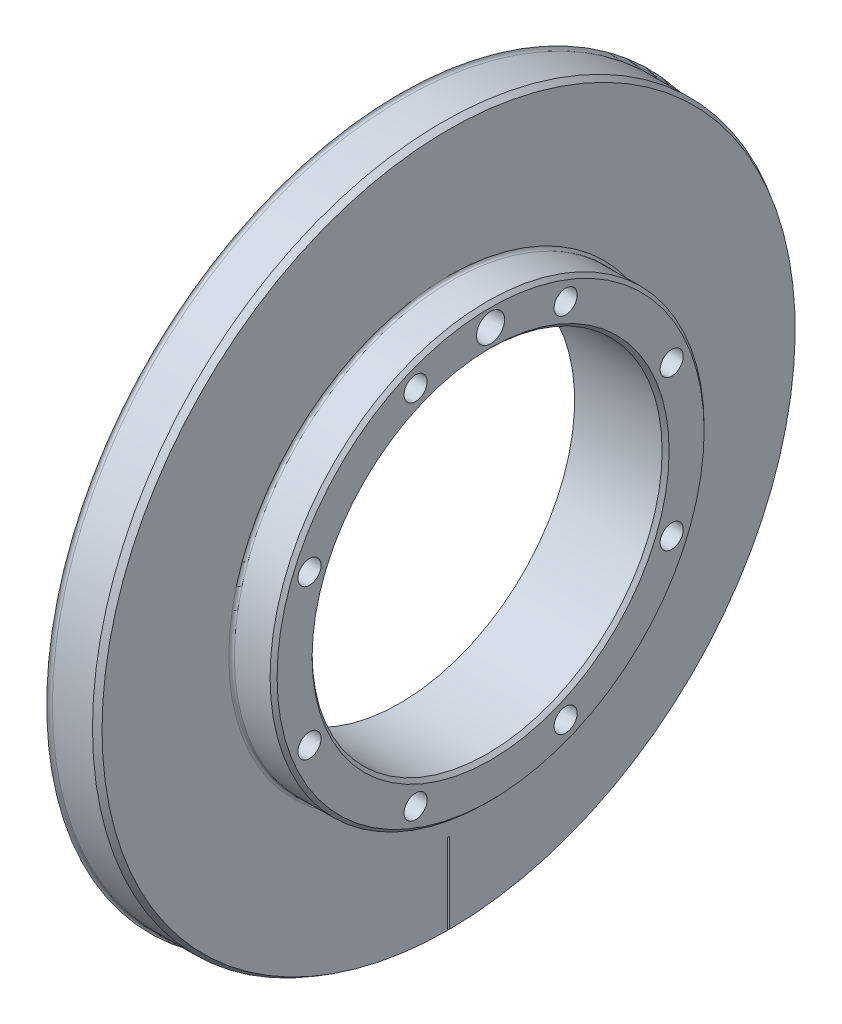
ISO-10303-21;
HEADER;
FILE_DESCRIPTION(('STEP AP214'),'2;1');
FILE_NAME('part.step','',(''),(''),'','','');
FILE_SCHEMA(('AUTOMOTIVE_DESIGN { 1 0 10303 214 1 1 1 1 }'));
ENDSEC;
DATA;
#1=APPLICATION_CONTEXT('core data for automotive mechanical design processes');
#2=APPLICATION_PROTOCOL_DEFINITION('international standard','automotive_design',2000,#1);
#3=PRODUCT_CONTEXT('',#1,'mechanical');
#4=PRODUCT('Part','Part','',(#3));
#5=PRODUCT_RELATED_PRODUCT_CATEGORY('part','',(#4));
#6=PRODUCT_DEFINITION_FORMATION('','',#4);
#7=PRODUCT_DEFINITION_CONTEXT('part definition',#1,'design');
#8=PRODUCT_DEFINITION('design','',#6,#7);
#9=PRODUCT_DEFINITION_SHAPE('','',#8);
#10=(LENGTH_UNIT() NAMED_UNIT(*) SI_UNIT(.MILLI.,.METRE.));
#11=(NAMED_UNIT(*) PLANE_ANGLE_UNIT() SI_UNIT($,.RADIAN.));
#12=(NAMED_UNIT(*) SI_UNIT($,.STERADIAN.) SOLID_ANGLE_UNIT());
#13=UNCERTAINTY_MEASURE_WITH_UNIT(LENGTH_MEASURE(1.E-05),#10,'distance_accuracy_value','');
#14=(GEOMETRIC_REPRESENTATION_CONTEXT(3) GLOBAL_UNCERTAINTY_ASSIGNED_CONTEXT((#13)) GLOBAL_UNIT_ASSIGNED_CONTEXT((#10,
#11,#12)) REPRESENTATION_CONTEXT('',''));
#15=CARTESIAN_POINT('',(0.,0.,0.));
#16=DIRECTION('',(0.,0.,1.));
#17=DIRECTION('',(1.,0.,0.));
#18=AXIS2_PLACEMENT_3D('',#15,#16,#17);
#19=CARTESIAN_POINT('',(1038.00000000098,1493.00000000001,0.));
#20=DIRECTION('',(1.,0.,0.));
#21=DIRECTION('',(0.,0.,-1.));
#22=AXIS2_PLACEMENT_3D('',#19,#20,#21);
#23=CONICAL_SURFACE('',#22,1.79999999936855,1.02974425749441);
#24=CARTESIAN_POINT('',(1037.99999999991,1493.00000000001,0.));
#25=DIRECTION('',(1.,0.,0.));
#26=DIRECTION('',(0.,0.,-1.));
#27=AXIS2_PLACEMENT_3D('',#24,#25,#26);
#28=CIRCLE('',#27,1.79999999999991);
#29=CARTESIAN_POINT('',(1037.99999999991,1493.00000000001,-1.79999999999991));
#30=VERTEX_POINT('',#29);
#31=EDGE_CURVE('E121',#30,#30,#28,.T.);
#32=ORIENTED_EDGE('',*,*,#31,.T.);
#33=EDGE_LOOP('',(#32));
#34=FACE_BOUND('',#33,.T.);
#35=CARTESIAN_POINT('',(1036.91845088429,1493.00000000001,0.));
#36=VERTEX_POINT('',#35);
#37=VERTEX_LOOP('',#36);
#38=FACE_BOUND('',#37,.T.);
#39=ADVANCED_FACE('F17',(#34,#38),#23,.F.);
#40=CARTESIAN_POINT('',(1036.51437343015,1493.00000000001,0.));
#41=DIRECTION('',(1.,0.,0.));
#42=DIRECTION('',(0.,0.,-1.));
#43=AXIS2_PLACEMENT_3D('',#40,#41,#42);
#44=CYLINDRICAL_SURFACE('',#43,1.79999999999991);
#45=ORIENTED_EDGE('',*,*,#31,.F.);
#46=EDGE_LOOP('',(#45));
#47=FACE_BOUND('',#46,.T.);
#48=CARTESIAN_POINT('',(1038.99999999991,1493.00000000001,0.));
#49=DIRECTION('',(1.,0.,0.));
#50=DIRECTION('',(0.,0.,-1.));
#51=AXIS2_PLACEMENT_3D('',#48,#49,#50);
#52=CIRCLE('',#51,1.79999999999991);
#53=CARTESIAN_POINT('',(1038.99999999991,1493.00000000001,-1.79999999999991));
#54=VERTEX_POINT('',#53);
#55=EDGE_CURVE('E164',#54,#54,#52,.T.);
#56=ORIENTED_EDGE('',*,*,#55,.T.);
#57=EDGE_LOOP('',(#56));
#58=FACE_BOUND('',#57,.T.);
#59=ADVANCED_FACE('F299',(#47,#58),#44,.F.);
#60=CARTESIAN_POINT('',(945.00000000003,1426.99999999988,0.));
#61=DIRECTION('',(0.,1.,0.));
#62=DIRECTION('',(0.,0.,1.));
#63=AXIS2_PLACEMENT_3D('',#60,#61,#62);
#64=PLANE('',#63);
#65=DIRECTION('',(-0.866025403784429,0.,0.500000000000017));
#66=VECTOR('',#65,1.);
#67=CARTESIAN_POINT('',(1038.99999999991,1426.99999999988,-0.14433756729744));
#68=LINE('',#67,#66);
#69=CARTESIAN_POINT('',(1038.75000000012,1426.99999999988,-9.87854998178485E-11));
#70=VERTEX_POINT('',#69);
#71=CARTESIAN_POINT('',(1038.99999999991,1426.99999999988,-0.14433756729744));
#72=VERTEX_POINT('',#71);
#73=EDGE_CURVE('E112',#70,#72,#68,.F.);
#74=ORIENTED_EDGE('',*,*,#73,.T.);
#75=DIRECTION('',(0.,0.,1.));
#76=VECTOR('',#75,1.);
#77=CARTESIAN_POINT('',(1038.99999999991,1426.99999999988,0.));
#78=LINE('',#77,#76);
#79=CARTESIAN_POINT('',(1038.99999999992,1426.99999999988,0.144337567278896));
#80=VERTEX_POINT('',#79);
#81=EDGE_CURVE('E166',#72,#80,#78,.T.);
#82=ORIENTED_EDGE('',*,*,#81,.T.);
#83=DIRECTION('',(0.866025403784429,0.,0.500000000000017));
#84=VECTOR('',#83,1.);
#85=CARTESIAN_POINT('',(1038.75000000004,1426.99999999988,0.));
#86=LINE('',#85,#84);
#87=EDGE_CURVE('E109',#80,#70,#86,.F.);
#88=ORIENTED_EDGE('',*,*,#87,.T.);
#89=EDGE_LOOP('',(#74,#82,#88));
#90=FACE_BOUND('',#89,.T.);
#91=ADVANCED_FACE('F297',(#90),#64,.F.);
#92=CARTESIAN_POINT('',(1038.75000000004,1426.99999999988,0.));
#93=DIRECTION('',(-0.500000000000017,0.,0.866025403784429));
#94=DIRECTION('',(0.866025403784429,0.,0.500000000000017));
#95=AXIS2_PLACEMENT_3D('',#92,#93,#94);
#96=PLANE('',#95);
#97=DIRECTION('',(0.,1.,0.));
#98=VECTOR('',#97,1.);
#99=CARTESIAN_POINT('',(1038.75000000016,1426.99999999988,-1.48180404578591E-10));
#100=LINE('',#99,#98);
#101=CARTESIAN_POINT('',(1038.74999975354,1415.35566229019,1.64934846772689E-08));
#102=VERTEX_POINT('',#101);
#103=EDGE_CURVE('E100',#102,#70,#100,.T.);
#104=ORIENTED_EDGE('',*,*,#103,.T.);
#105=ORIENTED_EDGE('',*,*,#87,.F.);
#106=DIRECTION('',(0.,1.,0.));
#107=VECTOR('',#106,1.);
#108=CARTESIAN_POINT('',(1038.99999999991,1464.99999999998,0.144337567297364));
#109=LINE('',#108,#107);
#110=CARTESIAN_POINT('',(1039.00000000012,1415.50021043778,0.144337567318507));
#111=VERTEX_POINT('',#110);
#112=EDGE_CURVE('E108',#80,#111,#109,.F.);
#113=ORIENTED_EDGE('',*,*,#112,.T.);
#114=CARTESIAN_POINT('',(1038.74999994207,1415.35566239901,-3.34663569285116E-08));
#115=CARTESIAN_POINT('',(1038.79167879641,1415.37972565586,0.0240632643035083));
#116=CARTESIAN_POINT('',(1038.83335156174,1415.40380295418,0.0481230465874393));
#117=CARTESIAN_POINT('',(1038.91668491442,1415.45198563376,0.0962355801894317));
#118=CARTESIAN_POINT('',(1038.95834550176,1415.47609101503,0.120288331507491));
#119=CARTESIAN_POINT('',(1039.00000000011,1415.50021043777,0.144337567339615));
#120=B_SPLINE_CURVE_WITH_KNOTS('',3,(#114,#115,#116,#117,#118,#119),.UNSPECIFIED.,.F.,.F.,(4,2,
4),(0.,0.161421433201902,0.322842866444055),.UNSPECIFIED.);
#121=EDGE_CURVE('E92',#102,#111,#120,.T.);
#122=ORIENTED_EDGE('',*,*,#121,.F.);
#123=EDGE_LOOP('',(#104,#105,#113,#122));
#124=FACE_BOUND('',#123,.T.);
#125=ADVANCED_FACE('F104',(#124),#96,.F.);
#126=CARTESIAN_POINT('',(1038.99999999991,1426.99999999988,-0.14433756729744));
#127=DIRECTION('',(-0.500000000000017,0.,-0.866025403784429));
#128=DIRECTION('',(-0.866025403784429,0.,0.500000000000017));
#129=AXIS2_PLACEMENT_3D('',#126,#127,#128);
#130=PLANE('',#129);
#131=ORIENTED_EDGE('',*,*,#103,.F.);
#132=CARTESIAN_POINT('',(1038.99999999998,1415.50021043785,-0.144337567463763));
#133=CARTESIAN_POINT('',(1038.9583455017,1415.47609101508,-0.120288331604589));
#134=CARTESIAN_POINT('',(1038.9166849144,1415.4519856338,-0.0962355802717079));
#135=CARTESIAN_POINT('',(1038.83335156178,1415.40380295421,-0.0481230466644701));
#136=CARTESIAN_POINT('',(1038.79167879646,1415.3797256559,-0.0240632643901151));
#137=CARTESIAN_POINT('',(1038.74999994213,1415.35566239907,3.33579455901028E-08));
#138=B_SPLINE_CURVE_WITH_KNOTS('',3,(#132,#133,#134,#135,#136,#137),.UNSPECIFIED.,.F.,.F.,(4,2,
4),(0.,0.161421433177669,0.322842866315485),.UNSPECIFIED.);
#139=CARTESIAN_POINT('',(1039.00000000008,1415.50021043778,-0.144337567343978));
#140=VERTEX_POINT('',#139);
#141=EDGE_CURVE('E89',#140,#102,#138,.T.);
#142=ORIENTED_EDGE('',*,*,#141,.F.);
#143=DIRECTION('',(0.,1.,0.));
#144=VECTOR('',#143,1.);
#145=CARTESIAN_POINT('',(1038.99999999991,1464.99999999998,-0.14433756729744));
#146=LINE('',#145,#144);
#147=EDGE_CURVE('E261',#140,#72,#146,.T.);
#148=ORIENTED_EDGE('',*,*,#147,.T.);
#149=ORIENTED_EDGE('',*,*,#73,.F.);
#150=EDGE_LOOP('',(#131,#142,#148,#149));
#151=FACE_BOUND('',#150,.T.);
#152=ADVANCED_FACE('F111',(#151),#130,.F.);
#153=CARTESIAN_POINT('',(1039.40000000001,1464.99999999998,0.));
#154=DIRECTION('',(-1.,0.,0.));
#155=DIRECTION('',(0.,-0.999975174771761,0.0070462642716927));
#156=AXIS2_PLACEMENT_3D('',#153,#154,#155);
#157=TOROIDAL_SURFACE('',#156,31.4000000000013,0.399999999999924);
#158=CARTESIAN_POINT('',(1039.40000000001,1464.99999999998,0.));
#159=DIRECTION('',(-1.,0.,0.));
#160=DIRECTION('',(0.,0.,1.));
#161=AXIS2_PLACEMENT_3D('',#158,#159,#160);
#162=CIRCLE('',#161,31.000000000003);
#163=CARTESIAN_POINT('',(1039.40000000001,1464.99999999998,31.000000000003));
#164=VERTEX_POINT('',#163);
#165=EDGE_CURVE('E114',#164,#164,#162,.F.);
#166=ORIENTED_EDGE('',*,*,#165,.F.);
#167=EDGE_LOOP('',(#166));
#168=FACE_BOUND('',#167,.T.);
#169=CARTESIAN_POINT('',(1039.00000000001,1464.99999999998,0.));
#170=DIRECTION('',(1.,0.,0.));
#171=DIRECTION('',(0.,1.,0.));
#172=AXIS2_PLACEMENT_3D('',#169,#170,#171);
#173=CIRCLE('',#172,31.3999999999761);
#174=CARTESIAN_POINT('',(1038.99999999997,1496.39999999997,0.));
#175=VERTEX_POINT('',#174);
#176=CARTESIAN_POINT('',(1038.99999999997,1433.6,0.));
#177=VERTEX_POINT('',#176);
#178=EDGE_CURVE('E254',#175,#177,#173,.T.);
#179=ORIENTED_EDGE('',*,*,#178,.T.);
#180=CARTESIAN_POINT('',(1039.00000000001,1464.99999999998,0.));
#181=DIRECTION('',(1.,0.,0.));
#182=DIRECTION('',(0.,-1.,0.));
#183=AXIS2_PLACEMENT_3D('',#180,#181,#182);
#184=CIRCLE('',#183,31.3999999999883);
#185=EDGE_CURVE('E252',#177,#175,#184,.T.);
#186=ORIENTED_EDGE('',*,*,#185,.T.);
#187=EDGE_LOOP('',(#179,#186));
#188=FACE_BOUND('',#187,.T.);
#189=ADVANCED_FACE('F274',(#168,#188),#157,.F.);
#190=CARTESIAN_POINT('',(1032.9999999999,1490.8686269103,-10.7151361062228));
#191=DIRECTION('',(1.,0.,0.));
#192=DIRECTION('',(0.,0.,-1.));
#193=AXIS2_PLACEMENT_3D('',#190,#191,#192);
#194=CONICAL_SURFACE('',#193,1.6499999999888,1.02974425748401);
#195=CARTESIAN_POINT('',(1032.00857997587,1490.8686269103,-10.715136106171));
#196=VERTEX_POINT('',#195);
#197=VERTEX_LOOP('',#196);
#198=FACE_BOUND('',#197,.T.);
#199=CARTESIAN_POINT('',(1032.99999999988,1490.8686269103,-10.7151361062228));
#200=DIRECTION('',(-1.,0.,0.));
#201=DIRECTION('',(0.,0.,1.));
#202=AXIS2_PLACEMENT_3D('',#199,#200,#201);
#203=CIRCLE('',#202,1.65);
#204=CARTESIAN_POINT('',(1032.99999999988,1490.8686269103,-9.0651361062228));
#205=VERTEX_POINT('',#204);
#206=EDGE_CURVE('E257',#205,#205,#203,.F.);
#207=ORIENTED_EDGE('',*,*,#206,.T.);
#208=EDGE_LOOP('',(#207));
#209=FACE_BOUND('',#208,.T.);
#210=ADVANCED_FACE('F278',(#198,#209),#194,.F.);
#211=CARTESIAN_POINT('',(1032.9999999999,1475.7151361062,-25.8686269103161));
#212=DIRECTION('',(1.,0.,0.));
#213=DIRECTION('',(0.,0.,-1.));
#214=AXIS2_PLACEMENT_3D('',#211,#212,#213);
#215=CONICAL_SURFACE('',#214,1.65000000004816,1.02974425751171);
#216=CARTESIAN_POINT('',(1032.00857997587,1475.7151361062,-25.8686269103237));
#217=VERTEX_POINT('',#216);
#218=VERTEX_LOOP('',#217);
#219=FACE_BOUND('',#218,.T.);
#220=CARTESIAN_POINT('',(1032.99999999988,1475.7151361062,-25.8686269103161));
#221=DIRECTION('',(-1.,0.,0.));
#222=DIRECTION('',(0.,0.,1.));
#223=AXIS2_PLACEMENT_3D('',#220,#221,#222);
#224=CIRCLE('',#223,1.65);
#225=CARTESIAN_POINT('',(1032.99999999988,1475.7151361062,-24.2186269103161));
#226=VERTEX_POINT('',#225);
#227=EDGE_CURVE('E259',#226,#226,#224,.F.);
#228=ORIENTED_EDGE('',*,*,#227,.T.);
#229=EDGE_LOOP('',(#228));
#230=FACE_BOUND('',#229,.T.);
#231=ADVANCED_FACE('F400',(#219,#230),#215,.F.);
#232=CARTESIAN_POINT('',(1032.9999999999,1454.28486389376,-25.8686269103161));
#233=DIRECTION('',(1.,0.,0.));
#234=DIRECTION('',(0.,0.,-1.));
#235=AXIS2_PLACEMENT_3D('',#232,#233,#234);
#236=CONICAL_SURFACE('',#235,1.65000000004816,1.02974425751171);
#237=CARTESIAN_POINT('',(1032.00857997587,1454.28486389376,-25.8686269103237));
#238=VERTEX_POINT('',#237);
#239=VERTEX_LOOP('',#238);
#240=FACE_BOUND('',#239,.T.);
#241=CARTESIAN_POINT('',(1032.99999999988,1454.28486389376,-25.8686269103161));
#242=DIRECTION('',(-1.,0.,0.));
#243=DIRECTION('',(0.,0.,1.));
#244=AXIS2_PLACEMENT_3D('',#241,#242,#243);
#245=CIRCLE('',#244,1.65);
#246=CARTESIAN_POINT('',(1032.99999999988,1454.28486389376,-24.2186269103161));
#247=VERTEX_POINT('',#246);
#248=EDGE_CURVE('E387',#247,#247,#245,.F.);
#249=ORIENTED_EDGE('',*,*,#248,.T.);
#250=EDGE_LOOP('',(#249));
#251=FACE_BOUND('',#250,.T.);
#252=ADVANCED_FACE('F403',(#240,#251),#236,.F.);
#253=CARTESIAN_POINT('',(1032.9999999999,1439.13137308967,-10.7151361062224));
#254=DIRECTION('',(1.,0.,0.));
#255=DIRECTION('',(0.,0.,-1.));
#256=AXIS2_PLACEMENT_3D('',#253,#254,#255);
#257=CONICAL_SURFACE('',#256,1.64999999998918,1.02974425748422);
#258=CARTESIAN_POINT('',(1032.00857997587,1439.13137308967,-10.715136106171));
#259=VERTEX_POINT('',#258);
#260=VERTEX_LOOP('',#259);
#261=FACE_BOUND('',#260,.T.);
#262=CARTESIAN_POINT('',(1032.99999999988,1439.13137308967,-10.7151361062224));
#263=DIRECTION('',(-1.,0.,0.));
#264=DIRECTION('',(0.,0.,1.));
#265=AXIS2_PLACEMENT_3D('',#262,#263,#264);
#266=CIRCLE('',#265,1.65);
#267=CARTESIAN_POINT('',(1032.99999999988,1439.13137308967,-9.06513610622242));
#268=VERTEX_POINT('',#267);
#269=EDGE_CURVE('E382',#268,#268,#266,.F.);
#270=ORIENTED_EDGE('',*,*,#269,.T.);
#271=EDGE_LOOP('',(#270));
#272=FACE_BOUND('',#271,.T.);
#273=ADVANCED_FACE('F409',(#261,#272),#257,.F.);
#274=CARTESIAN_POINT('',(1032.9999999999,1439.13137308967,10.7151361062225));
#275=DIRECTION('',(1.,0.,0.));
#276=DIRECTION('',(0.,0.,-1.));
#277=AXIS2_PLACEMENT_3D('',#274,#275,#276);
#278=CONICAL_SURFACE('',#277,1.64999999992147,1.02974425743788);
#279=CARTESIAN_POINT('',(1032.00857997581,1439.13137308967,10.7151361062847));
#280=VERTEX_POINT('',#279);
#281=VERTEX_LOOP('',#280);
#282=FACE_BOUND('',#281,.T.);
#283=CARTESIAN_POINT('',(1032.99999999988,1439.13137308967,10.7151361062225));
#284=DIRECTION('',(-1.,0.,0.));
#285=DIRECTION('',(0.,0.,1.));
#286=AXIS2_PLACEMENT_3D('',#283,#284,#285);
#287=CIRCLE('',#286,1.65);
#288=CARTESIAN_POINT('',(1032.99999999988,1439.13137308967,12.3651361062225));
#289=VERTEX_POINT('',#288);
#290=EDGE_CURVE('E377',#289,#289,#287,.F.);
#291=ORIENTED_EDGE('',*,*,#290,.T.);
#292=EDGE_LOOP('',(#291));
#293=FACE_BOUND('',#292,.T.);
#294=ADVANCED_FACE('F416',(#282,#293),#278,.F.);
#295=CARTESIAN_POINT('',(1032.9999999999,1454.28486389376,25.8686269103161));
#296=DIRECTION('',(1.,0.,0.));
#297=DIRECTION('',(0.,0.,-1.));
#298=AXIS2_PLACEMENT_3D('',#295,#296,#297);
#299=CONICAL_SURFACE('',#298,1.65000000003297,1.02974425748234);
#300=CARTESIAN_POINT('',(1032.00857997581,1454.28486389376,25.8686269103237));
#301=VERTEX_POINT('',#300);
#302=VERTEX_LOOP('',#301);
#303=FACE_BOUND('',#302,.T.);
#304=CARTESIAN_POINT('',(1032.99999999988,1454.28486389376,25.8686269103161));
#305=DIRECTION('',(-1.,0.,0.));
#306=DIRECTION('',(0.,0.,1.));
#307=AXIS2_PLACEMENT_3D('',#304,#305,#306);
#308=CIRCLE('',#307,1.65);
#309=CARTESIAN_POINT('',(1032.99999999988,1454.28486389376,27.5186269103161));
#310=VERTEX_POINT('',#309);
#311=EDGE_CURVE('E372',#310,#310,#308,.F.);
#312=ORIENTED_EDGE('',*,*,#311,.T.);
#313=EDGE_LOOP('',(#312));
#314=FACE_BOUND('',#313,.T.);
#315=ADVANCED_FACE('F420',(#303,#314),#299,.F.);
#316=CARTESIAN_POINT('',(1032.9999999999,1475.7151361062,25.8686269103161));
#317=DIRECTION('',(1.,0.,0.));
#318=DIRECTION('',(0.,0.,-1.));
#319=AXIS2_PLACEMENT_3D('',#316,#317,#318);
#320=CONICAL_SURFACE('',#319,1.65000000003297,1.02974425748234);
#321=CARTESIAN_POINT('',(1032.00857997581,1475.7151361062,25.8686269103237));
#322=VERTEX_POINT('',#321);
#323=VERTEX_LOOP('',#322);
#324=FACE_BOUND('',#323,.T.);
#325=CARTESIAN_POINT('',(1032.99999999988,1475.7151361062,25.8686269103161));
#326=DIRECTION('',(-1.,0.,0.));
#327=DIRECTION('',(0.,0.,1.));
#328=AXIS2_PLACEMENT_3D('',#325,#326,#327);
#329=CIRCLE('',#328,1.65);
#330=CARTESIAN_POINT('',(1032.99999999988,1475.7151361062,27.5186269103161));
#331=VERTEX_POINT('',#330);
#332=EDGE_CURVE('E367',#331,#331,#329,.F.);
#333=ORIENTED_EDGE('',*,*,#332,.T.);
#334=EDGE_LOOP('',(#333));
#335=FACE_BOUND('',#334,.T.);
#336=ADVANCED_FACE('F424',(#324,#335),#320,.F.);
#337=CARTESIAN_POINT('',(1032.9999999999,1490.8686269103,10.7151361062225));
#338=DIRECTION('',(1.,0.,0.));
#339=DIRECTION('',(0.,0.,-1.));
#340=AXIS2_PLACEMENT_3D('',#337,#338,#339);
#341=CONICAL_SURFACE('',#340,1.64999999992147,1.02974425743788);
#342=CARTESIAN_POINT('',(1032.00857997581,1490.8686269103,10.7151361062847));
#343=VERTEX_POINT('',#342);
#344=VERTEX_LOOP('',#343);
#345=FACE_BOUND('',#344,.T.);
#346=CARTESIAN_POINT('',(1032.99999999988,1490.8686269103,10.7151361062225));
#347=DIRECTION('',(-1.,0.,0.));
#348=DIRECTION('',(0.,0.,1.));
#349=AXIS2_PLACEMENT_3D('',#346,#347,#348);
#350=CIRCLE('',#349,1.65);
#351=CARTESIAN_POINT('',(1032.99999999988,1490.8686269103,12.3651361062225));
#352=VERTEX_POINT('',#351);
#353=EDGE_CURVE('E271',#352,#352,#350,.F.);
#354=ORIENTED_EDGE('',*,*,#353,.T.);
#355=EDGE_LOOP('',(#354));
#356=FACE_BOUND('',#355,.T.);
#357=ADVANCED_FACE('F428',(#345,#356),#341,.F.);
#358=CARTESIAN_POINT('',(1046.27500000004,1464.99999999998,0.));
#359=DIRECTION('',(-1.,0.,0.));
#360=DIRECTION('',(0.,0.,1.));
#361=AXIS2_PLACEMENT_3D('',#358,#359,#360);
#362=CYLINDRICAL_SURFACE('',#361,31.000000000003);
#363=CARTESIAN_POINT('',(1044.49999999978,1464.99999999998,0.));
#364=DIRECTION('',(-1.,0.,0.));
#365=DIRECTION('',(0.,0.,-1.));
#366=AXIS2_PLACEMENT_3D('',#363,#364,#365);
#367=CIRCLE('',#366,30.999999999766);
#368=CARTESIAN_POINT('',(1044.49999999978,1464.99999999998,-30.999999999766));
#369=VERTEX_POINT('',#368);
#370=EDGE_CURVE('E163',#369,#369,#367,.F.);
#371=ORIENTED_EDGE('',*,*,#370,.F.);
#372=EDGE_LOOP('',(#371));
#373=FACE_BOUND('',#372,.T.);
#374=ORIENTED_EDGE('',*,*,#165,.T.);
#375=EDGE_LOOP('',(#374));
#376=FACE_BOUND('',#375,.T.);
#377=ADVANCED_FACE('F431',(#373,#376),#362,.T.);
#378=CARTESIAN_POINT('',(1038.99999999991,1493.00000000001,0.));
#379=DIRECTION('',(-1.,0.,0.));
#380=DIRECTION('',(0.,0.,1.));
#381=AXIS2_PLACEMENT_3D('',#378,#379,#380);
#382=PLANE('',#381);
#383=ORIENTED_EDGE('',*,*,#55,.F.);
#384=EDGE_LOOP('',(#383));
#385=FACE_BOUND('',#384,.T.);
#386=CARTESIAN_POINT('',(1038.99999999991,1493.00000000001,0.));
#387=DIRECTION('',(-1.,0.,0.));
#388=DIRECTION('',(0.,0.,1.));
#389=AXIS2_PLACEMENT_3D('',#386,#387,#388);
#390=CIRCLE('',#389,1.99999999999987);
#391=CARTESIAN_POINT('',(1038.99999999991,1493.00000000001,1.99999999999987));
#392=VERTEX_POINT('',#391);
#393=EDGE_CURVE('E160',#392,#392,#390,.F.);
#394=ORIENTED_EDGE('',*,*,#393,.T.);
#395=EDGE_LOOP('',(#394));
#396=FACE_BOUND('',#395,.T.);
#397=ADVANCED_FACE('F231',(#385,#396),#382,.F.);
#398=CARTESIAN_POINT('',(1038.99999999991,1464.99999999998,0.));
#399=DIRECTION('',(-1.,0.,0.));
#400=DIRECTION('',(0.,0.,1.));
#401=AXIS2_PLACEMENT_3D('',#398,#399,#400);
#402=PLANE('',#401);
#403=ORIENTED_EDGE('',*,*,#178,.F.);
#404=ORIENTED_EDGE('',*,*,#185,.F.);
#405=EDGE_LOOP('',(#403,#404));
#406=FACE_BOUND('',#405,.T.);
#407=CARTESIAN_POINT('',(1039.00000000008,1464.99999999998,-5.27355936696949E-13));
#408=DIRECTION('',(-1.,0.,0.));
#409=DIRECTION('',(0.,0.,1.));
#410=AXIS2_PLACEMENT_3D('',#407,#408,#409);
#411=CIRCLE('',#410,49.500000000356);
#412=EDGE_CURVE('E95',#111,#140,#411,.T.);
#413=ORIENTED_EDGE('',*,*,#412,.F.);
#414=ORIENTED_EDGE('',*,*,#112,.F.);
#415=ORIENTED_EDGE('',*,*,#81,.F.);
#416=ORIENTED_EDGE('',*,*,#147,.F.);
#417=EDGE_LOOP('',(#413,#414,#415,#416));
#418=FACE_BOUND('',#417,.T.);
#419=ADVANCED_FACE('F226',(#406,#418),#402,.F.);
#420=CARTESIAN_POINT('',(1044.99999999988,1490.8686269103,-10.7151361062228));
#421=DIRECTION('',(-1.,0.,0.));
#422=DIRECTION('',(0.,0.,1.));
#423=AXIS2_PLACEMENT_3D('',#420,#421,#422);
#424=CYLINDRICAL_SURFACE('',#423,1.65);
#425=CARTESIAN_POINT('',(1044.99999999988,1490.8686269103,-10.7151361062228));
#426=DIRECTION('',(-1.,0.,0.));
#427=DIRECTION('',(0.,0.,1.));
#428=AXIS2_PLACEMENT_3D('',#425,#426,#427);
#429=CIRCLE('',#428,1.65);
#430=CARTESIAN_POINT('',(1044.99999999988,1490.8686269103,-9.0651361062228));
#431=VERTEX_POINT('',#430);
#432=EDGE_CURVE('E156',#431,#431,#429,.F.);
#433=ORIENTED_EDGE('',*,*,#432,.T.);
#434=EDGE_LOOP('',(#433));
#435=FACE_BOUND('',#434,.T.);
#436=ORIENTED_EDGE('',*,*,#206,.F.);
#437=EDGE_LOOP('',(#436));
#438=FACE_BOUND('',#437,.T.);
#439=ADVANCED_FACE('F222',(#435,#438),#424,.F.);
#440=CARTESIAN_POINT('',(1044.99999999988,1475.7151361062,-25.8686269103161));
#441=DIRECTION('',(-1.,0.,0.));
#442=DIRECTION('',(0.,0.,1.));
#443=AXIS2_PLACEMENT_3D('',#440,#441,#442);
#444=CYLINDRICAL_SURFACE('',#443,1.65);
#445=CARTESIAN_POINT('',(1044.99999999988,1475.7151361062,-25.8686269103161));
#446=DIRECTION('',(-1.,0.,0.));
#447=DIRECTION('',(0.,0.,1.));
#448=AXIS2_PLACEMENT_3D('',#445,#446,#447);
#449=CIRCLE('',#448,1.65);
#450=CARTESIAN_POINT('',(1044.99999999988,1475.7151361062,-24.2186269103161));
#451=VERTEX_POINT('',#450);
#452=EDGE_CURVE('E153',#451,#451,#449,.F.);
#453=ORIENTED_EDGE('',*,*,#452,.T.);
#454=EDGE_LOOP('',(#453));
#455=FACE_BOUND('',#454,.T.);
#456=ORIENTED_EDGE('',*,*,#227,.F.);
#457=EDGE_LOOP('',(#456));
#458=FACE_BOUND('',#457,.T.);
#459=ADVANCED_FACE('F218',(#455,#458),#444,.F.);
#460=CARTESIAN_POINT('',(1044.99999999988,1454.28486389376,-25.8686269103161));
#461=DIRECTION('',(-1.,0.,0.));
#462=DIRECTION('',(0.,0.,1.));
#463=AXIS2_PLACEMENT_3D('',#460,#461,#462);
#464=CYLINDRICAL_SURFACE('',#463,1.65);
#465=CARTESIAN_POINT('',(1044.99999999988,1454.28486389376,-25.8686269103161));
#466=DIRECTION('',(-1.,0.,0.));
#467=DIRECTION('',(0.,0.,1.));
#468=AXIS2_PLACEMENT_3D('',#465,#466,#467);
#469=CIRCLE('',#468,1.65);
#470=CARTESIAN_POINT('',(1044.99999999988,1454.28486389376,-24.2186269103161));
#471=VERTEX_POINT('',#470);
#472=EDGE_CURVE('E150',#471,#471,#469,.F.);
#473=ORIENTED_EDGE('',*,*,#472,.T.);
#474=EDGE_LOOP('',(#473));
#475=FACE_BOUND('',#474,.T.);
#476=ORIENTED_EDGE('',*,*,#248,.F.);
#477=EDGE_LOOP('',(#476));
#478=FACE_BOUND('',#477,.T.);
#479=ADVANCED_FACE('F214',(#475,#478),#464,.F.);
#480=CARTESIAN_POINT('',(1044.99999999988,1439.13137308967,-10.7151361062224));
#481=DIRECTION('',(-1.,0.,0.));
#482=DIRECTION('',(0.,0.,1.));
#483=AXIS2_PLACEMENT_3D('',#480,#481,#482);
#484=CYLINDRICAL_SURFACE('',#483,1.65);
#485=CARTESIAN_POINT('',(1044.99999999988,1439.13137308967,-10.7151361062224));
#486=DIRECTION('',(-1.,0.,0.));
#487=DIRECTION('',(0.,0.,1.));
#488=AXIS2_PLACEMENT_3D('',#485,#486,#487);
#489=CIRCLE('',#488,1.65);
#490=CARTESIAN_POINT('',(1044.99999999988,1439.13137308967,-9.06513610622242));
#491=VERTEX_POINT('',#490);
#492=EDGE_CURVE('E147',#491,#491,#489,.F.);
#493=ORIENTED_EDGE('',*,*,#492,.T.);
#494=EDGE_LOOP('',(#493));
#495=FACE_BOUND('',#494,.T.);
#496=ORIENTED_EDGE('',*,*,#269,.F.);
#497=EDGE_LOOP('',(#496));
#498=FACE_BOUND('',#497,.T.);
#499=ADVANCED_FACE('F210',(#495,#498),#484,.F.);
#500=CARTESIAN_POINT('',(1044.99999999988,1439.13137308967,10.7151361062225));
#501=DIRECTION('',(-1.,0.,0.));
#502=DIRECTION('',(0.,0.,1.));
#503=AXIS2_PLACEMENT_3D('',#500,#501,#502);
#504=CYLINDRICAL_SURFACE('',#503,1.65);
#505=CARTESIAN_POINT('',(1044.99999999988,1439.13137308967,10.7151361062225));
#506=DIRECTION('',(-1.,0.,0.));
#507=DIRECTION('',(0.,0.,1.));
#508=AXIS2_PLACEMENT_3D('',#505,#506,#507);
#509=CIRCLE('',#508,1.65);
#510=CARTESIAN_POINT('',(1044.99999999988,1439.13137308967,12.3651361062225));
#511=VERTEX_POINT('',#510);
#512=EDGE_CURVE('E144',#511,#511,#509,.F.);
#513=ORIENTED_EDGE('',*,*,#512,.T.);
#514=EDGE_LOOP('',(#513));
#515=FACE_BOUND('',#514,.T.);
#516=ORIENTED_EDGE('',*,*,#290,.F.);
#517=EDGE_LOOP('',(#516));
#518=FACE_BOUND('',#517,.T.);
#519=ADVANCED_FACE('F206',(#515,#518),#504,.F.);
#520=CARTESIAN_POINT('',(1044.99999999988,1454.28486389376,25.8686269103161));
#521=DIRECTION('',(-1.,0.,0.));
#522=DIRECTION('',(0.,0.,1.));
#523=AXIS2_PLACEMENT_3D('',#520,#521,#522);
#524=CYLINDRICAL_SURFACE('',#523,1.65);
#525=CARTESIAN_POINT('',(1044.99999999988,1454.28486389376,25.8686269103161));
#526=DIRECTION('',(-1.,0.,0.));
#527=DIRECTION('',(0.,0.,1.));
#528=AXIS2_PLACEMENT_3D('',#525,#526,#527);
#529=CIRCLE('',#528,1.65);
#530=CARTESIAN_POINT('',(1044.99999999988,1454.28486389376,27.5186269103161));
#531=VERTEX_POINT('',#530);
#532=EDGE_CURVE('E141',#531,#531,#529,.F.);
#533=ORIENTED_EDGE('',*,*,#532,.T.);
#534=EDGE_LOOP('',(#533));
#535=FACE_BOUND('',#534,.T.);
#536=ORIENTED_EDGE('',*,*,#311,.F.);
#537=EDGE_LOOP('',(#536));
#538=FACE_BOUND('',#537,.T.);
#539=ADVANCED_FACE('F202',(#535,#538),#524,.F.);
#540=CARTESIAN_POINT('',(1044.99999999988,1475.7151361062,25.8686269103161));
#541=DIRECTION('',(-1.,0.,0.));
#542=DIRECTION('',(0.,0.,1.));
#543=AXIS2_PLACEMENT_3D('',#540,#541,#542);
#544=CYLINDRICAL_SURFACE('',#543,1.65);
#545=CARTESIAN_POINT('',(1044.99999999988,1475.7151361062,25.8686269103161));
#546=DIRECTION('',(-1.,0.,0.));
#547=DIRECTION('',(0.,0.,1.));
#548=AXIS2_PLACEMENT_3D('',#545,#546,#547);
#549=CIRCLE('',#548,1.65);
#550=CARTESIAN_POINT('',(1044.99999999988,1475.7151361062,27.5186269103161));
#551=VERTEX_POINT('',#550);
#552=EDGE_CURVE('E138',#551,#551,#549,.F.);
#553=ORIENTED_EDGE('',*,*,#552,.T.);
#554=EDGE_LOOP('',(#553));
#555=FACE_BOUND('',#554,.T.);
#556=ORIENTED_EDGE('',*,*,#332,.F.);
#557=EDGE_LOOP('',(#556));
#558=FACE_BOUND('',#557,.T.);
#559=ADVANCED_FACE('F198',(#555,#558),#544,.F.);
#560=CARTESIAN_POINT('',(1044.99999999988,1490.8686269103,10.7151361062225));
#561=DIRECTION('',(-1.,0.,0.));
#562=DIRECTION('',(0.,0.,1.));
#563=AXIS2_PLACEMENT_3D('',#560,#561,#562);
#564=CYLINDRICAL_SURFACE('',#563,1.65);
#565=CARTESIAN_POINT('',(1044.99999999988,1490.8686269103,10.7151361062225));
#566=DIRECTION('',(-1.,0.,0.));
#567=DIRECTION('',(0.,0.,1.));
#568=AXIS2_PLACEMENT_3D('',#565,#566,#567);
#569=CIRCLE('',#568,1.65);
#570=CARTESIAN_POINT('',(1044.99999999988,1490.8686269103,12.3651361062225));
#571=VERTEX_POINT('',#570);
#572=EDGE_CURVE('E135',#571,#571,#569,.F.);
#573=ORIENTED_EDGE('',*,*,#572,.T.);
#574=EDGE_LOOP('',(#573));
#575=FACE_BOUND('',#574,.T.);
#576=ORIENTED_EDGE('',*,*,#353,.F.);
#577=EDGE_LOOP('',(#576));
#578=FACE_BOUND('',#577,.T.);
#579=ADVANCED_FACE('F194',(#575,#578),#564,.F.);
#580=CARTESIAN_POINT('',(1044.49999999978,1464.99999999998,0.));
#581=DIRECTION('',(-1.,0.,0.));
#582=DIRECTION('',(0.,0.,1.));
#583=AXIS2_PLACEMENT_3D('',#580,#581,#582);
#584=CONICAL_SURFACE('',#583,30.999999999766,0.785398162500017);
#585=CARTESIAN_POINT('',(1045.0000000001,1464.99999999998,0.));
#586=DIRECTION('',(-1.,0.,0.));
#587=DIRECTION('',(0.,0.,1.));
#588=AXIS2_PLACEMENT_3D('',#585,#586,#587);
#589=CIRCLE('',#588,30.5000000003437);
#590=CARTESIAN_POINT('',(1045.0000000001,1464.99999999998,30.5000000003437));
#591=VERTEX_POINT('',#590);
#592=EDGE_CURVE('E132',#591,#591,#589,.T.);
#593=ORIENTED_EDGE('',*,*,#592,.T.);
#594=EDGE_LOOP('',(#593));
#595=FACE_BOUND('',#594,.T.);
#596=ORIENTED_EDGE('',*,*,#370,.T.);
#597=EDGE_LOOP('',(#596));
#598=FACE_BOUND('',#597,.T.);
#599=ADVANCED_FACE('F190',(#595,#598),#584,.T.);
#600=CARTESIAN_POINT('',(1044.99999999988,1493.00000000001,0.));
#601=DIRECTION('',(-1.,0.,0.));
#602=DIRECTION('',(0.,0.,1.));
#603=AXIS2_PLACEMENT_3D('',#600,#601,#602);
#604=CYLINDRICAL_SURFACE('',#603,1.99999999999987);
#605=ORIENTED_EDGE('',*,*,#393,.F.);
#606=EDGE_LOOP('',(#605));
#607=FACE_BOUND('',#606,.T.);
#608=CARTESIAN_POINT('',(1044.99999999988,1493.00000000001,0.));
#609=DIRECTION('',(-1.,0.,0.));
#610=DIRECTION('',(0.,0.,1.));
#611=AXIS2_PLACEMENT_3D('',#608,#609,#610);
#612=CIRCLE('',#611,1.99999999999987);
#613=CARTESIAN_POINT('',(1044.99999999988,1493.00000000001,1.99999999999987));
#614=VERTEX_POINT('',#613);
#615=EDGE_CURVE('E129',#614,#614,#612,.F.);
#616=ORIENTED_EDGE('',*,*,#615,.T.);
#617=EDGE_LOOP('',(#616));
#618=FACE_BOUND('',#617,.T.);
#619=ADVANCED_FACE('F183',(#607,#618),#604,.F.);
#620=CARTESIAN_POINT('',(1038.13397459615,1464.99999999998,-5.27355936696949E-13));
#621=DIRECTION('',(-1.,0.,0.));
#622=DIRECTION('',(0.,0.,1.));
#623=AXIS2_PLACEMENT_3D('',#620,#621,#622);
#624=CONICAL_SURFACE('',#623,49.9999999997497,0.523598774999978);
#625=CARTESIAN_POINT('',(1038.13397459633,1464.99999999998,0.));
#626=DIRECTION('',(-1.,0.,0.));
#627=DIRECTION('',(0.,0.,1.));
#628=AXIS2_PLACEMENT_3D('',#625,#626,#627);
#629=CIRCLE('',#628,50.0000000000032);
#630=CARTESIAN_POINT('',(1038.13397459633,1464.99999999998,50.0000000000032));
#631=VERTEX_POINT('',#630);
#632=EDGE_CURVE('E128',#631,#631,#629,.T.);
#633=ORIENTED_EDGE('',*,*,#632,.F.);
#634=EDGE_LOOP('',(#633));
#635=FACE_BOUND('',#634,.T.);
#636=ORIENTED_EDGE('',*,*,#412,.T.);
#637=ORIENTED_EDGE('',*,*,#141,.T.);
#638=ORIENTED_EDGE('',*,*,#121,.T.);
#639=EDGE_LOOP('',(#636,#637,#638));
#640=FACE_BOUND('',#639,.T.);
#641=ADVANCED_FACE('F91',(#635,#640),#624,.T.);
#642=CARTESIAN_POINT('',(1044.99999999988,1464.99999999998,0.));
#643=DIRECTION('',(-1.,0.,0.));
#644=DIRECTION('',(0.,0.,1.));
#645=AXIS2_PLACEMENT_3D('',#642,#643,#644);
#646=PLANE('',#645);
#647=CARTESIAN_POINT('',(1045.00000000006,1464.99999999998,0.));
#648=DIRECTION('',(1.,0.,0.));
#649=DIRECTION('',(0.,0.,-1.));
#650=AXIS2_PLACEMENT_3D('',#647,#648,#649);
#651=CIRCLE('',#650,25.4999999997221);
#652=CARTESIAN_POINT('',(1045.00000000006,1464.99999999998,-25.4999999997221));
#653=VERTEX_POINT('',#652);
#654=EDGE_CURVE('E124',#653,#653,#651,.F.);
#655=ORIENTED_EDGE('',*,*,#654,.T.);
#656=EDGE_LOOP('',(#655));
#657=FACE_BOUND('',#656,.T.);
#658=ORIENTED_EDGE('',*,*,#615,.F.);
#659=EDGE_LOOP('',(#658));
#660=FACE_BOUND('',#659,.T.);
#661=ORIENTED_EDGE('',*,*,#592,.F.);
#662=EDGE_LOOP('',(#661));
#663=FACE_BOUND('',#662,.T.);
#664=ORIENTED_EDGE('',*,*,#572,.F.);
#665=EDGE_LOOP('',(#664));
#666=FACE_BOUND('',#665,.T.);
#667=ORIENTED_EDGE('',*,*,#552,.F.);
#668=EDGE_LOOP('',(#667));
#669=FACE_BOUND('',#668,.T.);
#670=ORIENTED_EDGE('',*,*,#532,.F.);
#671=EDGE_LOOP('',(#670));
#672=FACE_BOUND('',#671,.T.);
#673=ORIENTED_EDGE('',*,*,#512,.F.);
#674=EDGE_LOOP('',(#673));
#675=FACE_BOUND('',#674,.T.);
#676=ORIENTED_EDGE('',*,*,#492,.F.);
#677=EDGE_LOOP('',(#676));
#678=FACE_BOUND('',#677,.T.);
#679=ORIENTED_EDGE('',*,*,#472,.F.);
#680=EDGE_LOOP('',(#679));
#681=FACE_BOUND('',#680,.T.);
#682=ORIENTED_EDGE('',*,*,#452,.F.);
#683=EDGE_LOOP('',(#682));
#684=FACE_BOUND('',#683,.T.);
#685=ORIENTED_EDGE('',*,*,#432,.F.);
#686=EDGE_LOOP('',(#685));
#687=FACE_BOUND('',#686,.T.);
#688=ADVANCED_FACE('F182',(#657,#660,#663,#666,#669,#672,#675,#678,#681,#684,#687),#646,.F.);
#689=CARTESIAN_POINT('',(1046.27500000004,1464.99999999998,0.));
#690=DIRECTION('',(-1.,0.,0.));
#691=DIRECTION('',(0.,0.,1.));
#692=AXIS2_PLACEMENT_3D('',#689,#690,#691);
#693=CYLINDRICAL_SURFACE('',#692,50.0000000000032);
#694=ORIENTED_EDGE('',*,*,#632,.T.);
#695=EDGE_LOOP('',(#694));
#696=FACE_BOUND('',#695,.T.);
#697=CARTESIAN_POINT('',(1032.40000000004,1464.99999999998,0.));
#698=DIRECTION('',(-1.,0.,0.));
#699=DIRECTION('',(0.,-0.999990457157958,0.00436870610332283));
#700=AXIS2_PLACEMENT_3D('',#697,#698,#699);
#701=CIRCLE('',#700,50.0000000000016);
#702=CARTESIAN_POINT('',(1032.40000000004,1415.00047714208,0.218435305166149));
#703=VERTEX_POINT('',#702);
#704=EDGE_CURVE('E127',#703,#703,#701,.F.);
#705=ORIENTED_EDGE('',*,*,#704,.T.);
#706=EDGE_LOOP('',(#705));
#707=FACE_BOUND('',#706,.T.);
#708=ADVANCED_FACE('F454',(#696,#707),#693,.T.);
#709=CARTESIAN_POINT('',(1045.00000000006,1464.99999999998,0.));
#710=DIRECTION('',(1.,0.,0.));
#711=DIRECTION('',(0.,0.,-1.));
#712=AXIS2_PLACEMENT_3D('',#709,#710,#711);
#713=CONICAL_SURFACE('',#712,25.4999999997221,0.785398162500024);
#714=CARTESIAN_POINT('',(1044.49999999989,1464.99999999998,0.));
#715=DIRECTION('',(-1.,0.,0.));
#716=DIRECTION('',(0.,0.,1.));
#717=AXIS2_PLACEMENT_3D('',#714,#715,#716);
#718=CIRCLE('',#717,24.9999999999991);
#719=CARTESIAN_POINT('',(1044.49999999989,1464.99999999998,24.9999999999991));
#720=VERTEX_POINT('',#719);
#721=EDGE_CURVE('E356',#720,#720,#718,.T.);
#722=ORIENTED_EDGE('',*,*,#721,.T.);
#723=EDGE_LOOP('',(#722));
#724=FACE_BOUND('',#723,.T.);
#725=ORIENTED_EDGE('',*,*,#654,.F.);
#726=EDGE_LOOP('',(#725));
#727=FACE_BOUND('',#726,.T.);
#728=ADVANCED_FACE('F341',(#724,#727),#713,.F.);
#729=CARTESIAN_POINT('',(1032.40000000004,1464.99999999998,0.));
#730=DIRECTION('',(-1.,0.,0.));
#731=DIRECTION('',(0.,-0.999990457157958,0.00436870610332283));
#732=AXIS2_PLACEMENT_3D('',#729,#730,#731);
#733=TOROIDAL_SURFACE('',#732,50.4000000000016,0.399999999999924);
#734=ORIENTED_EDGE('',*,*,#704,.F.);
#735=EDGE_LOOP('',(#734));
#736=FACE_BOUND('',#735,.T.);
#737=CARTESIAN_POINT('',(1032.00000000004,1464.99999999998,0.));
#738=DIRECTION('',(1.,0.,0.));
#739=DIRECTION('',(0.,1.,0.));
#740=AXIS2_PLACEMENT_3D('',#737,#738,#739);
#741=CIRCLE('',#740,50.3999999999001);
#742=CARTESIAN_POINT('',(1032.,1414.60000000005,0.));
#743=VERTEX_POINT('',#742);
#744=CARTESIAN_POINT('',(1032.,1515.39999999991,-1.68243258299293E-13));
#745=VERTEX_POINT('',#744);
#746=EDGE_CURVE('E355',#743,#745,#741,.F.);
#747=ORIENTED_EDGE('',*,*,#746,.F.);
#748=CARTESIAN_POINT('',(1032.00000000004,1464.99999999998,0.));
#749=DIRECTION('',(1.,0.,0.));
#750=DIRECTION('',(0.,-1.,0.));
#751=AXIS2_PLACEMENT_3D('',#748,#749,#750);
#752=CIRCLE('',#751,50.3999999999509);
#753=EDGE_CURVE('E28',#745,#743,#752,.F.);
#754=ORIENTED_EDGE('',*,*,#753,.F.);
#755=EDGE_LOOP('',(#747,#754));
#756=FACE_BOUND('',#755,.T.);
#757=ADVANCED_FACE('F315',(#736,#756),#733,.F.);
#758=CARTESIAN_POINT('',(1046.27500000004,1464.99999999998,0.));
#759=DIRECTION('',(-1.,0.,0.));
#760=DIRECTION('',(0.,0.,1.));
#761=AXIS2_PLACEMENT_3D('',#758,#759,#760);
#762=CYLINDRICAL_SURFACE('',#761,24.9999999999991);
#763=ORIENTED_EDGE('',*,*,#721,.F.);
#764=EDGE_LOOP('',(#763));
#765=FACE_BOUND('',#764,.T.);
#766=CARTESIAN_POINT('',(1031.99999999994,1464.99999999998,0.));
#767=DIRECTION('',(-1.,0.,0.));
#768=DIRECTION('',(0.,0.,1.));
#769=AXIS2_PLACEMENT_3D('',#766,#767,#768);
#770=CIRCLE('',#769,24.9999999999991);
#771=CARTESIAN_POINT('',(1031.99999999994,1464.99999999998,24.9999999999991));
#772=VERTEX_POINT('',#771);
#773=EDGE_CURVE('E11',#772,#772,#770,.F.);
#774=ORIENTED_EDGE('',*,*,#773,.F.);
#775=EDGE_LOOP('',(#774));
#776=FACE_BOUND('',#775,.T.);
#777=ADVANCED_FACE('F309',(#765,#776),#762,.F.);
#778=CARTESIAN_POINT('',(1031.99999999994,1464.99999999998,0.));
#779=DIRECTION('',(-1.,0.,0.));
#780=DIRECTION('',(0.,0.,1.));
#781=AXIS2_PLACEMENT_3D('',#778,#779,#780);
#782=PLANE('',#781);
#783=ORIENTED_EDGE('',*,*,#773,.T.);
#784=EDGE_LOOP('',(#783));
#785=FACE_BOUND('',#784,.T.);
#786=ORIENTED_EDGE('',*,*,#746,.T.);
#787=ORIENTED_EDGE('',*,*,#753,.T.);
#788=EDGE_LOOP('',(#786,#787));
#789=FACE_BOUND('',#788,.T.);
#790=ADVANCED_FACE('F307',(#785,#789),#782,.T.);
#791=CLOSED_SHELL('',(#39,#59,#91,#125,#152,#189,#210,#231,#252,#273,#294,#315,#336,#357,#377,
#397,#419,#439,#459,#479,#499,#519,#539,#559,#579,#599,#619,#641,#688,#708,#728,#757,#777,#790));
#792=MANIFOLD_SOLID_BREP('B1',#791);
#793=ADVANCED_BREP_SHAPE_REPRESENTATION('',(#18,#792),#14);
#794=SHAPE_DEFINITION_REPRESENTATION(#9,#793);
ENDSEC;
END-ISO-10303-21;
